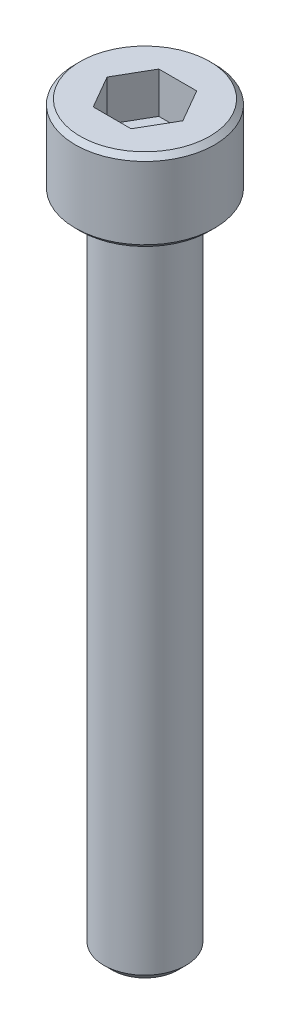
ISO-10303-21;
HEADER;
FILE_DESCRIPTION(('STEP AP214'),'2;1');
FILE_NAME('part.step','',(''),(''),'','','');
FILE_SCHEMA(('AUTOMOTIVE_DESIGN { 1 0 10303 214 1 1 1 1 }'));
ENDSEC;
DATA;
#1=APPLICATION_CONTEXT('core data for automotive mechanical design processes');
#2=APPLICATION_PROTOCOL_DEFINITION('international standard','automotive_design',2000,#1);
#3=PRODUCT_CONTEXT('',#1,'mechanical');
#4=PRODUCT('Part','Part','',(#3));
#5=PRODUCT_RELATED_PRODUCT_CATEGORY('part','',(#4));
#6=PRODUCT_DEFINITION_FORMATION('','',#4);
#7=PRODUCT_DEFINITION_CONTEXT('part definition',#1,'design');
#8=PRODUCT_DEFINITION('design','',#6,#7);
#9=PRODUCT_DEFINITION_SHAPE('','',#8);
#10=(LENGTH_UNIT() NAMED_UNIT(*) SI_UNIT(.MILLI.,.METRE.));
#11=(NAMED_UNIT(*) PLANE_ANGLE_UNIT() SI_UNIT($,.RADIAN.));
#12=(NAMED_UNIT(*) SI_UNIT($,.STERADIAN.) SOLID_ANGLE_UNIT());
#13=UNCERTAINTY_MEASURE_WITH_UNIT(LENGTH_MEASURE(1.E-05),#10,'distance_accuracy_value','');
#14=(GEOMETRIC_REPRESENTATION_CONTEXT(3) GLOBAL_UNCERTAINTY_ASSIGNED_CONTEXT((#13)) GLOBAL_UNIT_ASSIGNED_CONTEXT((#10,
#11,#12)) REPRESENTATION_CONTEXT('',''));
#15=CARTESIAN_POINT('',(0.,0.,0.));
#16=DIRECTION('',(0.,0.,1.));
#17=DIRECTION('',(1.,0.,0.));
#18=AXIS2_PLACEMENT_3D('',#15,#16,#17);
#19=CARTESIAN_POINT('',(-2.309401077,2.5,2.));
#20=DIRECTION('',(0.,-1.,0.));
#21=DIRECTION('',(0.,0.,-1.));
#22=AXIS2_PLACEMENT_3D('',#19,#20,#21);
#23=PLANE('',#22);
#24=DIRECTION('',(-1.,0.,0.));
#25=VECTOR('',#24,1.);
#26=CARTESIAN_POINT('',(1.154700538,2.5,-2.));
#27=LINE('',#26,#25);
#28=CARTESIAN_POINT('',(1.15470053791702,2.5,-1.99999999994587));
#29=VERTEX_POINT('',#28);
#30=CARTESIAN_POINT('',(-1.15470053791702,2.5,-2.0000000003061));
#31=VERTEX_POINT('',#30);
#32=EDGE_CURVE('E67',#29,#31,#27,.T.);
#33=ORIENTED_EDGE('',*,*,#32,.T.);
#34=DIRECTION('',(-0.500000000201594,0.,0.866025403668048));
#35=VECTOR('',#34,1.);
#36=CARTESIAN_POINT('',(-1.154700538,2.5,-2.));
#37=LINE('',#36,#35);
#38=CARTESIAN_POINT('',(-2.309401077,2.5,2.79508630903188E-10));
#39=VERTEX_POINT('',#38);
#40=EDGE_CURVE('E90',#31,#39,#37,.T.);
#41=ORIENTED_EDGE('',*,*,#40,.T.);
#42=DIRECTION('',(0.500000000201594,0.,0.866025403668048));
#43=VECTOR('',#42,1.);
#44=CARTESIAN_POINT('',(-2.309401077,2.5,0.));
#45=LINE('',#44,#43);
#46=CARTESIAN_POINT('',(-1.15470053787015,2.5,1.99999999997294));
#47=VERTEX_POINT('',#46);
#48=EDGE_CURVE('E131',#39,#47,#45,.T.);
#49=ORIENTED_EDGE('',*,*,#48,.T.);
#50=DIRECTION('',(1.,0.,0.));
#51=VECTOR('',#50,1.);
#52=CARTESIAN_POINT('',(-1.154700538,2.5,2.));
#53=LINE('',#52,#51);
#54=CARTESIAN_POINT('',(1.15470053791702,2.5,2.0000000003061));
#55=VERTEX_POINT('',#54);
#56=EDGE_CURVE('E126',#47,#55,#53,.T.);
#57=ORIENTED_EDGE('',*,*,#56,.T.);
#58=DIRECTION('',(0.500000000201594,0.,-0.866025403668048));
#59=VECTOR('',#58,1.);
#60=CARTESIAN_POINT('',(1.154700538,2.5,2.));
#61=LINE('',#60,#59);
#62=CARTESIAN_POINT('',(2.30940107687897,2.5,-3.49385303455748E-10));
#63=VERTEX_POINT('',#62);
#64=EDGE_CURVE('E73',#55,#63,#61,.T.);
#65=ORIENTED_EDGE('',*,*,#64,.T.);
#66=DIRECTION('',(-0.500000000201594,0.,-0.866025403668048));
#67=VECTOR('',#66,1.);
#68=CARTESIAN_POINT('',(2.309401077,2.5,0.));
#69=LINE('',#68,#67);
#70=EDGE_CURVE('E70',#63,#29,#69,.T.);
#71=ORIENTED_EDGE('',*,*,#70,.T.);
#72=EDGE_LOOP('',(#33,#41,#49,#57,#65,#71));
#73=FACE_BOUND('',#72,.T.);
#74=ADVANCED_FACE('F16',(#73),#23,.F.);
#75=CARTESIAN_POINT('',(2.309401077,2.5,0.));
#76=DIRECTION('',(0.866025403668048,0.,-0.500000000201594));
#77=DIRECTION('',(-0.500000000201594,0.,-0.866025403668048));
#78=AXIS2_PLACEMENT_3D('',#75,#76,#77);
#79=PLANE('',#78);
#80=ORIENTED_EDGE('',*,*,#70,.F.);
#81=DIRECTION('',(0.,1.,0.));
#82=VECTOR('',#81,1.);
#83=CARTESIAN_POINT('',(2.30940107716137,2.5,-2.7950862110937E-10));
#84=LINE('',#83,#82);
#85=CARTESIAN_POINT('',(2.30940107704034,5.,-6.98770622515956E-11));
#86=VERTEX_POINT('',#85);
#87=EDGE_CURVE('E121',#63,#86,#84,.T.);
#88=ORIENTED_EDGE('',*,*,#87,.T.);
#89=DIRECTION('',(-0.500000000201594,0.,-0.866025403668048));
#90=VECTOR('',#89,1.);
#91=CARTESIAN_POINT('',(2.309401077,5.,0.));
#92=LINE('',#91,#90);
#93=CARTESIAN_POINT('',(1.1547005376778,5.,-2.00000000025197));
#94=VERTEX_POINT('',#93);
#95=EDGE_CURVE('E81',#86,#94,#92,.T.);
#96=ORIENTED_EDGE('',*,*,#95,.T.);
#97=DIRECTION('',(0.,1.,0.));
#98=VECTOR('',#97,1.);
#99=CARTESIAN_POINT('',(1.15470053729309,2.5,-2.));
#100=LINE('',#99,#98);
#101=EDGE_CURVE('E76',#94,#29,#100,.F.);
#102=ORIENTED_EDGE('',*,*,#101,.T.);
#103=EDGE_LOOP('',(#80,#88,#96,#102));
#104=FACE_BOUND('',#103,.T.);
#105=ADVANCED_FACE('F79',(#104),#79,.F.);
#106=CARTESIAN_POINT('',(1.154700538,2.5,-2.));
#107=DIRECTION('',(0.,0.,-1.));
#108=DIRECTION('',(-1.,0.,0.));
#109=AXIS2_PLACEMENT_3D('',#106,#107,#108);
#110=PLANE('',#109);
#111=ORIENTED_EDGE('',*,*,#32,.F.);
#112=ORIENTED_EDGE('',*,*,#101,.F.);
#113=DIRECTION('',(1.,0.,0.));
#114=VECTOR('',#113,1.);
#115=CARTESIAN_POINT('',(-3.9974,5.,-2.0000000012244));
#116=LINE('',#115,#114);
#117=CARTESIAN_POINT('',(-1.15470053770905,5.,-2.0000000006122));
#118=VERTEX_POINT('',#117);
#119=EDGE_CURVE('E118',#94,#118,#116,.F.);
#120=ORIENTED_EDGE('',*,*,#119,.T.);
#121=DIRECTION('',(0.,1.,0.));
#122=VECTOR('',#121,1.);
#123=CARTESIAN_POINT('',(-1.15470053729309,2.5,-2.0000000012244));
#124=LINE('',#123,#122);
#125=EDGE_CURVE('E87',#118,#31,#124,.F.);
#126=ORIENTED_EDGE('',*,*,#125,.T.);
#127=EDGE_LOOP('',(#111,#112,#120,#126));
#128=FACE_BOUND('',#127,.T.);
#129=ADVANCED_FACE('F85',(#128),#110,.F.);
#130=CARTESIAN_POINT('',(-1.154700538,2.5,-2.));
#131=DIRECTION('',(-0.866025403668048,0.,-0.500000000201594));
#132=DIRECTION('',(-0.500000000201594,0.,0.866025403668048));
#133=AXIS2_PLACEMENT_3D('',#130,#131,#132);
#134=PLANE('',#133);
#135=ORIENTED_EDGE('',*,*,#40,.F.);
#136=ORIENTED_EDGE('',*,*,#125,.F.);
#137=DIRECTION('',(-0.500000000201594,0.,0.866025403668048));
#138=VECTOR('',#137,1.);
#139=CARTESIAN_POINT('',(-1.15470053729309,5.,-2.0000000012244));
#140=LINE('',#139,#138);
#141=CARTESIAN_POINT('',(-2.30940107708069,5.,1.39754428768721E-10));
#142=VERTEX_POINT('',#141);
#143=EDGE_CURVE('E116',#118,#142,#140,.T.);
#144=ORIENTED_EDGE('',*,*,#143,.T.);
#145=DIRECTION('',(0.,1.,0.));
#146=VECTOR('',#145,1.);
#147=CARTESIAN_POINT('',(-2.309401077,2.5,0.));
#148=LINE('',#147,#146);
#149=EDGE_CURVE('E133',#142,#39,#148,.F.);
#150=ORIENTED_EDGE('',*,*,#149,.T.);
#151=EDGE_LOOP('',(#135,#136,#144,#150));
#152=FACE_BOUND('',#151,.T.);
#153=ADVANCED_FACE('F138',(#152),#134,.F.);
#154=CARTESIAN_POINT('',(-2.309401077,2.5,0.));
#155=DIRECTION('',(-0.866025403668048,0.,0.500000000201594));
#156=DIRECTION('',(0.500000000201594,0.,0.866025403668048));
#157=AXIS2_PLACEMENT_3D('',#154,#155,#156);
#158=PLANE('',#157);
#159=ORIENTED_EDGE('',*,*,#48,.F.);
#160=ORIENTED_EDGE('',*,*,#149,.F.);
#161=DIRECTION('',(0.500000000201594,0.,0.866025403668048));
#162=VECTOR('',#161,1.);
#163=CARTESIAN_POINT('',(-2.309401077,5.,0.));
#164=LINE('',#163,#162);
#165=CARTESIAN_POINT('',(-1.15470053766217,5.,2.00000000027904));
#166=VERTEX_POINT('',#165);
#167=EDGE_CURVE('E114',#142,#166,#164,.T.);
#168=ORIENTED_EDGE('',*,*,#167,.T.);
#169=DIRECTION('',(0.,1.,0.));
#170=VECTOR('',#169,1.);
#171=CARTESIAN_POINT('',(-1.15470053729309,2.5,2.));
#172=LINE('',#171,#170);
#173=EDGE_CURVE('E128',#166,#47,#172,.F.);
#174=ORIENTED_EDGE('',*,*,#173,.T.);
#175=EDGE_LOOP('',(#159,#160,#168,#174));
#176=FACE_BOUND('',#175,.T.);
#177=ADVANCED_FACE('F142',(#176),#158,.F.);
#178=CARTESIAN_POINT('',(-1.154700538,2.5,2.));
#179=DIRECTION('',(0.,0.,1.));
#180=DIRECTION('',(1.,0.,0.));
#181=AXIS2_PLACEMENT_3D('',#178,#179,#180);
#182=PLANE('',#181);
#183=ORIENTED_EDGE('',*,*,#56,.F.);
#184=ORIENTED_EDGE('',*,*,#173,.F.);
#185=DIRECTION('',(1.,0.,0.));
#186=VECTOR('',#185,1.);
#187=CARTESIAN_POINT('',(-3.9974,5.,2.0000000012244));
#188=LINE('',#187,#186);
#189=CARTESIAN_POINT('',(1.15470053770905,5.,2.0000000006122));
#190=VERTEX_POINT('',#189);
#191=EDGE_CURVE('E34',#166,#190,#188,.T.);
#192=ORIENTED_EDGE('',*,*,#191,.T.);
#193=DIRECTION('',(0.,1.,0.));
#194=VECTOR('',#193,1.);
#195=CARTESIAN_POINT('',(1.15470053729309,2.5,2.0000000012244));
#196=LINE('',#195,#194);
#197=EDGE_CURVE('E124',#190,#55,#196,.F.);
#198=ORIENTED_EDGE('',*,*,#197,.T.);
#199=EDGE_LOOP('',(#183,#184,#192,#198));
#200=FACE_BOUND('',#199,.T.);
#201=ADVANCED_FACE('F144',(#200),#182,.F.);
#202=CARTESIAN_POINT('',(1.154700538,2.5,2.));
#203=DIRECTION('',(0.866025403668048,0.,0.500000000201594));
#204=DIRECTION('',(0.500000000201594,0.,-0.866025403668048));
#205=AXIS2_PLACEMENT_3D('',#202,#203,#204);
#206=PLANE('',#205);
#207=ORIENTED_EDGE('',*,*,#64,.F.);
#208=ORIENTED_EDGE('',*,*,#197,.F.);
#209=DIRECTION('',(0.500000000201594,0.,-0.866025403668048));
#210=VECTOR('',#209,1.);
#211=CARTESIAN_POINT('',(1.15470053729309,5.,2.0000000012244));
#212=LINE('',#211,#210);
#213=EDGE_CURVE('E110',#190,#86,#212,.T.);
#214=ORIENTED_EDGE('',*,*,#213,.T.);
#215=ORIENTED_EDGE('',*,*,#87,.F.);
#216=EDGE_LOOP('',(#207,#208,#214,#215));
#217=FACE_BOUND('',#216,.T.);
#218=ADVANCED_FACE('F147',(#217),#206,.F.);
#219=CARTESIAN_POINT('',(-3.9974,5.,3.9974));
#220=DIRECTION('',(0.,-1.,0.));
#221=DIRECTION('',(0.,0.,-1.));
#222=AXIS2_PLACEMENT_3D('',#219,#220,#221);
#223=PLANE('',#222);
#224=CARTESIAN_POINT('',(0.,5.0000000000523,0.));
#225=DIRECTION('',(0.,-1.,0.));
#226=DIRECTION('',(1.,0.,0.));
#227=AXIS2_PLACEMENT_3D('',#224,#225,#226);
#228=CIRCLE('',#227,3.94999999997481);
#229=CARTESIAN_POINT('',(3.94999999997481,5.0000000000523,0.));
#230=VERTEX_POINT('',#229);
#231=EDGE_CURVE('E19',#230,#230,#228,.T.);
#232=ORIENTED_EDGE('',*,*,#231,.F.);
#233=EDGE_LOOP('',(#232));
#234=FACE_BOUND('',#233,.T.);
#235=ORIENTED_EDGE('',*,*,#191,.F.);
#236=ORIENTED_EDGE('',*,*,#167,.F.);
#237=ORIENTED_EDGE('',*,*,#143,.F.);
#238=ORIENTED_EDGE('',*,*,#119,.F.);
#239=ORIENTED_EDGE('',*,*,#95,.F.);
#240=ORIENTED_EDGE('',*,*,#213,.F.);
#241=EDGE_LOOP('',(#235,#236,#237,#238,#239,#240));
#242=FACE_BOUND('',#241,.T.);
#243=ADVANCED_FACE('F149',(#234,#242),#223,.F.);
#244=CARTESIAN_POINT('',(0.,4.69999999990023,0.));
#245=DIRECTION('',(0.,-1.,0.));
#246=DIRECTION('',(1.,0.,0.));
#247=AXIS2_PLACEMENT_3D('',#244,#245,#246);
#248=CONICAL_SURFACE('',#247,4.25000000007003,0.785398163302709);
#249=ORIENTED_EDGE('',*,*,#231,.T.);
#250=EDGE_LOOP('',(#249));
#251=FACE_BOUND('',#250,.T.);
#252=CARTESIAN_POINT('',(0.,4.69999999999993,0.));
#253=DIRECTION('',(0.,1.,0.));
#254=DIRECTION('',(0.,0.,1.));
#255=AXIS2_PLACEMENT_3D('',#252,#253,#254);
#256=CIRCLE('',#255,4.25);
#257=CARTESIAN_POINT('',(0.,4.69999999999993,4.25));
#258=VERTEX_POINT('',#257);
#259=EDGE_CURVE('E102',#258,#258,#256,.F.);
#260=ORIENTED_EDGE('',*,*,#259,.F.);
#261=EDGE_LOOP('',(#260));
#262=FACE_BOUND('',#261,.T.);
#263=ADVANCED_FACE('F151',(#251,#262),#248,.T.);
#264=CARTESIAN_POINT('',(0.,0.3,0.));
#265=DIRECTION('',(0.,1.,0.));
#266=DIRECTION('',(0.,0.,1.));
#267=AXIS2_PLACEMENT_3D('',#264,#265,#266);
#268=CYLINDRICAL_SURFACE('',#267,4.25);
#269=CARTESIAN_POINT('',(0.,0.300000000038381,0.));
#270=DIRECTION('',(0.,1.,0.));
#271=DIRECTION('',(0.,0.,1.));
#272=AXIS2_PLACEMENT_3D('',#269,#270,#271);
#273=CIRCLE('',#272,4.25000000001319);
#274=CARTESIAN_POINT('',(0.,0.300000000038381,4.25000000001319));
#275=VERTEX_POINT('',#274);
#276=EDGE_CURVE('E98',#275,#275,#273,.F.);
#277=ORIENTED_EDGE('',*,*,#276,.F.);
#278=EDGE_LOOP('',(#277));
#279=FACE_BOUND('',#278,.T.);
#280=ORIENTED_EDGE('',*,*,#259,.T.);
#281=EDGE_LOOP('',(#280));
#282=FACE_BOUND('',#281,.T.);
#283=ADVANCED_FACE('F159',(#279,#282),#268,.T.);
#284=CARTESIAN_POINT('',(0.,0.300000000038381,0.));
#285=DIRECTION('',(0.,1.,0.));
#286=DIRECTION('',(0.,0.,1.));
#287=AXIS2_PLACEMENT_3D('',#284,#285,#286);
#288=CONICAL_SURFACE('',#287,4.25000000001319,0.785398163397448);
#289=CARTESIAN_POINT('',(0.,0.,0.));
#290=DIRECTION('',(0.,1.,0.));
#291=DIRECTION('',(0.,0.,1.));
#292=AXIS2_PLACEMENT_3D('',#289,#290,#291);
#293=CIRCLE('',#292,3.94999999997481);
#294=CARTESIAN_POINT('',(0.,0.,3.94999999997481));
#295=VERTEX_POINT('',#294);
#296=EDGE_CURVE('E96',#295,#295,#293,.T.);
#297=ORIENTED_EDGE('',*,*,#296,.T.);
#298=EDGE_LOOP('',(#297));
#299=FACE_BOUND('',#298,.T.);
#300=ORIENTED_EDGE('',*,*,#276,.T.);
#301=EDGE_LOOP('',(#300));
#302=FACE_BOUND('',#301,.T.);
#303=ADVANCED_FACE('F183',(#299,#302),#288,.T.);
#304=CARTESIAN_POINT('',(-2.024,-40.,-2.024));
#305=DIRECTION('',(0.,1.,0.));
#306=DIRECTION('',(0.,0.,1.));
#307=AXIS2_PLACEMENT_3D('',#304,#305,#306);
#308=PLANE('',#307);
#309=CARTESIAN_POINT('',(0.,-40.0000000000205,0.));
#310=DIRECTION('',(0.,1.,0.));
#311=DIRECTION('',(-1.,0.,0.));
#312=AXIS2_PLACEMENT_3D('',#309,#310,#311);
#313=CIRCLE('',#312,1.9999999999527);
#314=CARTESIAN_POINT('',(-1.9999999999527,-40.0000000000205,0.));
#315=VERTEX_POINT('',#314);
#316=EDGE_CURVE('E94',#315,#315,#313,.T.);
#317=ORIENTED_EDGE('',*,*,#316,.F.);
#318=EDGE_LOOP('',(#317));
#319=FACE_BOUND('',#318,.T.);
#320=ADVANCED_FACE('F179',(#319),#308,.F.);
#321=CARTESIAN_POINT('',(-3.9974,0.,-3.9974));
#322=DIRECTION('',(0.,1.,0.));
#323=DIRECTION('',(0.,0.,1.));
#324=AXIS2_PLACEMENT_3D('',#321,#322,#323);
#325=PLANE('',#324);
#326=ORIENTED_EDGE('',*,*,#296,.F.);
#327=EDGE_LOOP('',(#326));
#328=FACE_BOUND('',#327,.T.);
#329=CARTESIAN_POINT('',(0.,0.,0.));
#330=DIRECTION('',(0.,1.,0.));
#331=DIRECTION('',(0.,0.,1.));
#332=AXIS2_PLACEMENT_3D('',#329,#330,#331);
#333=CIRCLE('',#332,2.5);
#334=CARTESIAN_POINT('',(0.,0.,2.5));
#335=VERTEX_POINT('',#334);
#336=EDGE_CURVE('E11',#335,#335,#333,.F.);
#337=ORIENTED_EDGE('',*,*,#336,.F.);
#338=EDGE_LOOP('',(#337));
#339=FACE_BOUND('',#338,.T.);
#340=ADVANCED_FACE('F172',(#328,#339),#325,.F.);
#341=CARTESIAN_POINT('',(0.,-39.4999999999754,0.));
#342=DIRECTION('',(0.,1.,0.));
#343=DIRECTION('',(-1.,0.,0.));
#344=AXIS2_PLACEMENT_3D('',#341,#342,#343);
#345=CONICAL_SURFACE('',#344,2.49999999999773,0.785398163397447);
#346=CARTESIAN_POINT('',(0.,-39.5,0.));
#347=DIRECTION('',(0.,1.,0.));
#348=DIRECTION('',(0.,0.,1.));
#349=AXIS2_PLACEMENT_3D('',#346,#347,#348);
#350=CIRCLE('',#349,2.5);
#351=CARTESIAN_POINT('',(0.,-39.5,2.5));
#352=VERTEX_POINT('',#351);
#353=EDGE_CURVE('E25',#352,#352,#350,.T.);
#354=ORIENTED_EDGE('',*,*,#353,.F.);
#355=EDGE_LOOP('',(#354));
#356=FACE_BOUND('',#355,.T.);
#357=ORIENTED_EDGE('',*,*,#316,.T.);
#358=EDGE_LOOP('',(#357));
#359=FACE_BOUND('',#358,.T.);
#360=ADVANCED_FACE('F166',(#356,#359),#345,.T.);
#361=CARTESIAN_POINT('',(0.,-39.5,0.));
#362=DIRECTION('',(0.,1.,0.));
#363=DIRECTION('',(0.,0.,1.));
#364=AXIS2_PLACEMENT_3D('',#361,#362,#363);
#365=CYLINDRICAL_SURFACE('',#364,2.5);
#366=ORIENTED_EDGE('',*,*,#336,.T.);
#367=EDGE_LOOP('',(#366));
#368=FACE_BOUND('',#367,.T.);
#369=ORIENTED_EDGE('',*,*,#353,.T.);
#370=EDGE_LOOP('',(#369));
#371=FACE_BOUND('',#370,.T.);
#372=ADVANCED_FACE('F164',(#368,#371),#365,.T.);
#373=CLOSED_SHELL('',(#74,#105,#129,#153,#177,#201,#218,#243,#263,#283,#303,#320,#340,#360,#372));
#374=MANIFOLD_SOLID_BREP('B1',#373);
#375=ADVANCED_BREP_SHAPE_REPRESENTATION('',(#18,#374),#14);
#376=SHAPE_DEFINITION_REPRESENTATION(#9,#375);
ENDSEC;
END-ISO-10303-21;
